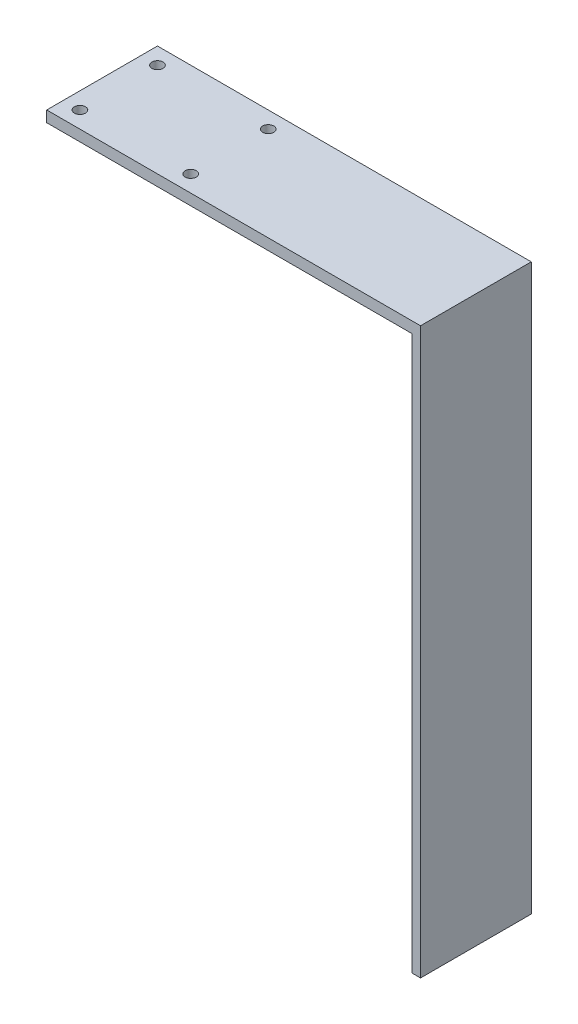
ISO-10303-21;
HEADER;
FILE_DESCRIPTION(('STEP AP214'),'2;1');
FILE_NAME('part.step','',(''),(''),'','','');
FILE_SCHEMA(('AUTOMOTIVE_DESIGN { 1 0 10303 214 1 1 1 1 }'));
ENDSEC;
DATA;
#1=APPLICATION_CONTEXT('core data for automotive mechanical design processes');
#2=APPLICATION_PROTOCOL_DEFINITION('international standard','automotive_design',2000,#1);
#3=PRODUCT_CONTEXT('',#1,'mechanical');
#4=PRODUCT('Part','Part','',(#3));
#5=PRODUCT_RELATED_PRODUCT_CATEGORY('part','',(#4));
#6=PRODUCT_DEFINITION_FORMATION('','',#4);
#7=PRODUCT_DEFINITION_CONTEXT('part definition',#1,'design');
#8=PRODUCT_DEFINITION('design','',#6,#7);
#9=PRODUCT_DEFINITION_SHAPE('','',#8);
#10=(LENGTH_UNIT() NAMED_UNIT(*) SI_UNIT(.MILLI.,.METRE.));
#11=(NAMED_UNIT(*) PLANE_ANGLE_UNIT() SI_UNIT($,.RADIAN.));
#12=(NAMED_UNIT(*) SI_UNIT($,.STERADIAN.) SOLID_ANGLE_UNIT());
#13=UNCERTAINTY_MEASURE_WITH_UNIT(LENGTH_MEASURE(1.E-05),#10,'distance_accuracy_value','');
#14=(GEOMETRIC_REPRESENTATION_CONTEXT(3) GLOBAL_UNCERTAINTY_ASSIGNED_CONTEXT((#13)) GLOBAL_UNIT_ASSIGNED_CONTEXT((#10,
#11,#12)) REPRESENTATION_CONTEXT('',''));
#15=CARTESIAN_POINT('',(0.,0.,0.));
#16=DIRECTION('',(0.,0.,1.));
#17=DIRECTION('',(1.,0.,0.));
#18=AXIS2_PLACEMENT_3D('',#15,#16,#17);
#19=CARTESIAN_POINT('',(0.,0.,0.));
#20=DIRECTION('',(0.,1.,0.));
#21=DIRECTION('',(0.,0.,1.));
#22=AXIS2_PLACEMENT_3D('',#19,#20,#21);
#23=PLANE('',#22);
#24=CARTESIAN_POINT('',(-61.5,0.,-14.));
#25=DIRECTION('',(0.,1.,0.));
#26=DIRECTION('',(0.,0.,1.));
#27=AXIS2_PLACEMENT_3D('',#24,#25,#26);
#28=CIRCLE('',#27,2.);
#29=CARTESIAN_POINT('',(-61.5,0.,-12.));
#30=VERTEX_POINT('',#29);
#31=EDGE_CURVE('E127',#30,#30,#28,.T.);
#32=ORIENTED_EDGE('',*,*,#31,.T.);
#33=EDGE_LOOP('',(#32));
#34=FACE_BOUND('',#33,.T.);
#35=CARTESIAN_POINT('',(-21.5,0.,14.));
#36=DIRECTION('',(0.,1.,0.));
#37=DIRECTION('',(0.,0.,1.));
#38=AXIS2_PLACEMENT_3D('',#35,#36,#37);
#39=CIRCLE('',#38,2.);
#40=CARTESIAN_POINT('',(-21.5,0.,16.));
#41=VERTEX_POINT('',#40);
#42=EDGE_CURVE('E131',#41,#41,#39,.T.);
#43=ORIENTED_EDGE('',*,*,#42,.T.);
#44=EDGE_LOOP('',(#43));
#45=FACE_BOUND('',#44,.T.);
#46=CARTESIAN_POINT('',(-61.5,0.,14.));
#47=DIRECTION('',(0.,1.,0.));
#48=DIRECTION('',(0.,0.,1.));
#49=AXIS2_PLACEMENT_3D('',#46,#47,#48);
#50=CIRCLE('',#49,2.);
#51=CARTESIAN_POINT('',(-61.5,0.,16.));
#52=VERTEX_POINT('',#51);
#53=EDGE_CURVE('E137',#52,#52,#50,.T.);
#54=ORIENTED_EDGE('',*,*,#53,.T.);
#55=EDGE_LOOP('',(#54));
#56=FACE_BOUND('',#55,.T.);
#57=CARTESIAN_POINT('',(-21.5,0.,-14.));
#58=DIRECTION('',(0.,1.,0.));
#59=DIRECTION('',(0.,0.,1.));
#60=AXIS2_PLACEMENT_3D('',#57,#58,#59);
#61=CIRCLE('',#60,2.);
#62=CARTESIAN_POINT('',(-21.5,0.,-12.));
#63=VERTEX_POINT('',#62);
#64=EDGE_CURVE('E143',#63,#63,#61,.T.);
#65=ORIENTED_EDGE('',*,*,#64,.T.);
#66=EDGE_LOOP('',(#65));
#67=FACE_BOUND('',#66,.T.);
#68=DIRECTION('',(0.,0.,-1.));
#69=VECTOR('',#68,1.);
#70=CARTESIAN_POINT('',(64.5,0.,20.));
#71=LINE('',#70,#69);
#72=CARTESIAN_POINT('',(64.5,0.,20.));
#73=VERTEX_POINT('',#72);
#74=CARTESIAN_POINT('',(64.5,0.,-20.));
#75=VERTEX_POINT('',#74);
#76=EDGE_CURVE('E48',#73,#75,#71,.T.);
#77=ORIENTED_EDGE('',*,*,#76,.F.);
#78=DIRECTION('',(1.,0.,0.));
#79=VECTOR('',#78,1.);
#80=CARTESIAN_POINT('',(-67.5,0.,20.));
#81=LINE('',#80,#79);
#82=CARTESIAN_POINT('',(-67.5,0.,20.));
#83=VERTEX_POINT('',#82);
#84=EDGE_CURVE('E153',#83,#73,#81,.T.);
#85=ORIENTED_EDGE('',*,*,#84,.F.);
#86=DIRECTION('',(0.,0.,1.));
#87=VECTOR('',#86,1.);
#88=CARTESIAN_POINT('',(-67.5,0.,-20.));
#89=LINE('',#88,#87);
#90=CARTESIAN_POINT('',(-67.5,0.,-20.));
#91=VERTEX_POINT('',#90);
#92=EDGE_CURVE('E73',#91,#83,#89,.T.);
#93=ORIENTED_EDGE('',*,*,#92,.F.);
#94=DIRECTION('',(-1.,0.,0.));
#95=VECTOR('',#94,1.);
#96=CARTESIAN_POINT('',(-67.5,0.,-20.));
#97=LINE('',#96,#95);
#98=EDGE_CURVE('E149',#75,#91,#97,.T.);
#99=ORIENTED_EDGE('',*,*,#98,.F.);
#100=EDGE_LOOP('',(#77,#85,#93,#99));
#101=FACE_BOUND('',#100,.T.);
#102=ADVANCED_FACE('F33',(#34,#45,#56,#67,#101),#23,.F.);
#103=CARTESIAN_POINT('',(0.,4.,0.));
#104=DIRECTION('',(0.,1.,0.));
#105=DIRECTION('',(0.,0.,1.));
#106=AXIS2_PLACEMENT_3D('',#103,#104,#105);
#107=PLANE('',#106);
#108=CARTESIAN_POINT('',(-21.5,4.,14.));
#109=DIRECTION('',(0.,1.,0.));
#110=DIRECTION('',(0.,0.,1.));
#111=AXIS2_PLACEMENT_3D('',#108,#109,#110);
#112=CIRCLE('',#111,2.);
#113=CARTESIAN_POINT('',(-21.5,4.,16.));
#114=VERTEX_POINT('',#113);
#115=EDGE_CURVE('E134',#114,#114,#112,.T.);
#116=ORIENTED_EDGE('',*,*,#115,.F.);
#117=EDGE_LOOP('',(#116));
#118=FACE_BOUND('',#117,.T.);
#119=CARTESIAN_POINT('',(-21.5,4.,-14.));
#120=DIRECTION('',(0.,1.,0.));
#121=DIRECTION('',(0.,0.,1.));
#122=AXIS2_PLACEMENT_3D('',#119,#120,#121);
#123=CIRCLE('',#122,2.);
#124=CARTESIAN_POINT('',(-21.5,4.,-12.));
#125=VERTEX_POINT('',#124);
#126=EDGE_CURVE('E146',#125,#125,#123,.T.);
#127=ORIENTED_EDGE('',*,*,#126,.F.);
#128=EDGE_LOOP('',(#127));
#129=FACE_BOUND('',#128,.T.);
#130=DIRECTION('',(0.,0.,-1.));
#131=VECTOR('',#130,1.);
#132=CARTESIAN_POINT('',(67.5,4.,-20.));
#133=LINE('',#132,#131);
#134=CARTESIAN_POINT('',(67.5,4.,20.));
#135=VERTEX_POINT('',#134);
#136=CARTESIAN_POINT('',(67.5,4.,-20.));
#137=VERTEX_POINT('',#136);
#138=EDGE_CURVE('E101',#135,#137,#133,.T.);
#139=ORIENTED_EDGE('',*,*,#138,.T.);
#140=DIRECTION('',(-1.,0.,0.));
#141=VECTOR('',#140,1.);
#142=CARTESIAN_POINT('',(-67.5,4.,-20.));
#143=LINE('',#142,#141);
#144=CARTESIAN_POINT('',(-67.5,4.,-20.));
#145=VERTEX_POINT('',#144);
#146=EDGE_CURVE('E80',#137,#145,#143,.T.);
#147=ORIENTED_EDGE('',*,*,#146,.T.);
#148=DIRECTION('',(0.,0.,1.));
#149=VECTOR('',#148,1.);
#150=CARTESIAN_POINT('',(-67.5,4.,-20.));
#151=LINE('',#150,#149);
#152=CARTESIAN_POINT('',(-67.5,4.,20.));
#153=VERTEX_POINT('',#152);
#154=EDGE_CURVE('E155',#145,#153,#151,.T.);
#155=ORIENTED_EDGE('',*,*,#154,.T.);
#156=DIRECTION('',(1.,0.,0.));
#157=VECTOR('',#156,1.);
#158=CARTESIAN_POINT('',(-67.5,4.,20.));
#159=LINE('',#158,#157);
#160=EDGE_CURVE('E57',#153,#135,#159,.T.);
#161=ORIENTED_EDGE('',*,*,#160,.T.);
#162=EDGE_LOOP('',(#139,#147,#155,#161));
#163=FACE_BOUND('',#162,.T.);
#164=CARTESIAN_POINT('',(-61.5,4.,14.));
#165=DIRECTION('',(0.,1.,0.));
#166=DIRECTION('',(0.,0.,1.));
#167=AXIS2_PLACEMENT_3D('',#164,#165,#166);
#168=CIRCLE('',#167,2.);
#169=CARTESIAN_POINT('',(-61.5,4.,16.));
#170=VERTEX_POINT('',#169);
#171=EDGE_CURVE('E140',#170,#170,#168,.T.);
#172=ORIENTED_EDGE('',*,*,#171,.F.);
#173=EDGE_LOOP('',(#172));
#174=FACE_BOUND('',#173,.T.);
#175=CARTESIAN_POINT('',(-61.5,4.,-14.));
#176=DIRECTION('',(0.,1.,0.));
#177=DIRECTION('',(0.,0.,1.));
#178=AXIS2_PLACEMENT_3D('',#175,#176,#177);
#179=CIRCLE('',#178,2.);
#180=CARTESIAN_POINT('',(-61.5,4.,-12.));
#181=VERTEX_POINT('',#180);
#182=EDGE_CURVE('E128',#181,#181,#179,.T.);
#183=ORIENTED_EDGE('',*,*,#182,.F.);
#184=EDGE_LOOP('',(#183));
#185=FACE_BOUND('',#184,.T.);
#186=ADVANCED_FACE('F173',(#118,#129,#163,#174,#185),#107,.T.);
#187=CARTESIAN_POINT('',(67.5,4.,-20.));
#188=DIRECTION('',(-1.,0.,0.));
#189=DIRECTION('',(0.,0.,1.));
#190=AXIS2_PLACEMENT_3D('',#187,#188,#189);
#191=PLANE('',#190);
#192=DIRECTION('',(0.,-1.,0.));
#193=VECTOR('',#192,1.);
#194=CARTESIAN_POINT('',(67.5,4.,20.));
#195=LINE('',#194,#193);
#196=CARTESIAN_POINT('',(67.5,-200.,20.));
#197=VERTEX_POINT('',#196);
#198=EDGE_CURVE('E96',#135,#197,#195,.T.);
#199=ORIENTED_EDGE('',*,*,#198,.T.);
#200=DIRECTION('',(0.,0.,1.));
#201=VECTOR('',#200,1.);
#202=CARTESIAN_POINT('',(67.5,-200.,20.));
#203=LINE('',#202,#201);
#204=CARTESIAN_POINT('',(67.5,-200.,-20.));
#205=VERTEX_POINT('',#204);
#206=EDGE_CURVE('E100',#205,#197,#203,.T.);
#207=ORIENTED_EDGE('',*,*,#206,.F.);
#208=DIRECTION('',(0.,-1.,0.));
#209=VECTOR('',#208,1.);
#210=CARTESIAN_POINT('',(67.5,4.,-20.));
#211=LINE('',#210,#209);
#212=EDGE_CURVE('E11',#137,#205,#211,.T.);
#213=ORIENTED_EDGE('',*,*,#212,.F.);
#214=ORIENTED_EDGE('',*,*,#138,.F.);
#215=EDGE_LOOP('',(#199,#207,#213,#214));
#216=FACE_BOUND('',#215,.T.);
#217=ADVANCED_FACE('F35',(#216),#191,.F.);
#218=CARTESIAN_POINT('',(-67.5,4.,-20.));
#219=DIRECTION('',(0.,0.,1.));
#220=DIRECTION('',(1.,0.,0.));
#221=AXIS2_PLACEMENT_3D('',#218,#219,#220);
#222=PLANE('',#221);
#223=ORIENTED_EDGE('',*,*,#212,.T.);
#224=DIRECTION('',(1.,0.,0.));
#225=VECTOR('',#224,1.);
#226=CARTESIAN_POINT('',(67.5,-200.,-20.));
#227=LINE('',#226,#225);
#228=CARTESIAN_POINT('',(64.5,-200.,-20.));
#229=VERTEX_POINT('',#228);
#230=EDGE_CURVE('E117',#229,#205,#227,.T.);
#231=ORIENTED_EDGE('',*,*,#230,.F.);
#232=DIRECTION('',(0.,1.,0.));
#233=VECTOR('',#232,1.);
#234=CARTESIAN_POINT('',(64.5,-200.,-20.));
#235=LINE('',#234,#233);
#236=EDGE_CURVE('E122',#229,#75,#235,.T.);
#237=ORIENTED_EDGE('',*,*,#236,.T.);
#238=ORIENTED_EDGE('',*,*,#98,.T.);
#239=DIRECTION('',(0.,-1.,0.));
#240=VECTOR('',#239,1.);
#241=CARTESIAN_POINT('',(-67.5,4.,-20.));
#242=LINE('',#241,#240);
#243=EDGE_CURVE('E41',#145,#91,#242,.T.);
#244=ORIENTED_EDGE('',*,*,#243,.F.);
#245=ORIENTED_EDGE('',*,*,#146,.F.);
#246=EDGE_LOOP('',(#223,#231,#237,#238,#244,#245));
#247=FACE_BOUND('',#246,.T.);
#248=ADVANCED_FACE('F166',(#247),#222,.F.);
#249=CARTESIAN_POINT('',(-67.5,4.,-20.));
#250=DIRECTION('',(1.,0.,0.));
#251=DIRECTION('',(0.,0.,-1.));
#252=AXIS2_PLACEMENT_3D('',#249,#250,#251);
#253=PLANE('',#252);
#254=ORIENTED_EDGE('',*,*,#92,.T.);
#255=DIRECTION('',(0.,-1.,0.));
#256=VECTOR('',#255,1.);
#257=CARTESIAN_POINT('',(-67.5,4.,20.));
#258=LINE('',#257,#256);
#259=EDGE_CURVE('E103',#153,#83,#258,.T.);
#260=ORIENTED_EDGE('',*,*,#259,.F.);
#261=ORIENTED_EDGE('',*,*,#154,.F.);
#262=ORIENTED_EDGE('',*,*,#243,.T.);
#263=EDGE_LOOP('',(#254,#260,#261,#262));
#264=FACE_BOUND('',#263,.T.);
#265=ADVANCED_FACE('F162',(#264),#253,.F.);
#266=CARTESIAN_POINT('',(-67.5,4.,20.));
#267=DIRECTION('',(0.,0.,-1.));
#268=DIRECTION('',(-1.,0.,0.));
#269=AXIS2_PLACEMENT_3D('',#266,#267,#268);
#270=PLANE('',#269);
#271=ORIENTED_EDGE('',*,*,#84,.T.);
#272=DIRECTION('',(0.,1.,0.));
#273=VECTOR('',#272,1.);
#274=CARTESIAN_POINT('',(64.5,-200.,20.));
#275=LINE('',#274,#273);
#276=CARTESIAN_POINT('',(64.5,-200.,20.));
#277=VERTEX_POINT('',#276);
#278=EDGE_CURVE('E109',#277,#73,#275,.T.);
#279=ORIENTED_EDGE('',*,*,#278,.F.);
#280=DIRECTION('',(-1.,0.,0.));
#281=VECTOR('',#280,1.);
#282=CARTESIAN_POINT('',(67.5,-200.,20.));
#283=LINE('',#282,#281);
#284=EDGE_CURVE('E106',#197,#277,#283,.T.);
#285=ORIENTED_EDGE('',*,*,#284,.F.);
#286=ORIENTED_EDGE('',*,*,#198,.F.);
#287=ORIENTED_EDGE('',*,*,#160,.F.);
#288=ORIENTED_EDGE('',*,*,#259,.T.);
#289=EDGE_LOOP('',(#271,#279,#285,#286,#287,#288));
#290=FACE_BOUND('',#289,.T.);
#291=ADVANCED_FACE('F107',(#290),#270,.F.);
#292=CARTESIAN_POINT('',(-21.5,4.,-14.));
#293=DIRECTION('',(0.,-1.,0.));
#294=DIRECTION('',(0.,0.,-1.));
#295=AXIS2_PLACEMENT_3D('',#292,#293,#294);
#296=CYLINDRICAL_SURFACE('',#295,2.);
#297=ORIENTED_EDGE('',*,*,#126,.T.);
#298=EDGE_LOOP('',(#297));
#299=FACE_BOUND('',#298,.T.);
#300=ORIENTED_EDGE('',*,*,#64,.F.);
#301=EDGE_LOOP('',(#300));
#302=FACE_BOUND('',#301,.T.);
#303=ADVANCED_FACE('F186',(#299,#302),#296,.F.);
#304=CARTESIAN_POINT('',(-61.5,4.,14.));
#305=DIRECTION('',(0.,-1.,0.));
#306=DIRECTION('',(0.,0.,-1.));
#307=AXIS2_PLACEMENT_3D('',#304,#305,#306);
#308=CYLINDRICAL_SURFACE('',#307,2.);
#309=ORIENTED_EDGE('',*,*,#171,.T.);
#310=EDGE_LOOP('',(#309));
#311=FACE_BOUND('',#310,.T.);
#312=ORIENTED_EDGE('',*,*,#53,.F.);
#313=EDGE_LOOP('',(#312));
#314=FACE_BOUND('',#313,.T.);
#315=ADVANCED_FACE('F190',(#311,#314),#308,.F.);
#316=CARTESIAN_POINT('',(-21.5,4.,14.));
#317=DIRECTION('',(0.,-1.,0.));
#318=DIRECTION('',(0.,0.,-1.));
#319=AXIS2_PLACEMENT_3D('',#316,#317,#318);
#320=CYLINDRICAL_SURFACE('',#319,2.);
#321=ORIENTED_EDGE('',*,*,#115,.T.);
#322=EDGE_LOOP('',(#321));
#323=FACE_BOUND('',#322,.T.);
#324=ORIENTED_EDGE('',*,*,#42,.F.);
#325=EDGE_LOOP('',(#324));
#326=FACE_BOUND('',#325,.T.);
#327=ADVANCED_FACE('F195',(#323,#326),#320,.F.);
#328=CARTESIAN_POINT('',(-61.5,4.,-14.));
#329=DIRECTION('',(0.,-1.,0.));
#330=DIRECTION('',(0.,0.,-1.));
#331=AXIS2_PLACEMENT_3D('',#328,#329,#330);
#332=CYLINDRICAL_SURFACE('',#331,2.);
#333=ORIENTED_EDGE('',*,*,#182,.T.);
#334=EDGE_LOOP('',(#333));
#335=FACE_BOUND('',#334,.T.);
#336=ORIENTED_EDGE('',*,*,#31,.F.);
#337=EDGE_LOOP('',(#336));
#338=FACE_BOUND('',#337,.T.);
#339=ADVANCED_FACE('F202',(#335,#338),#332,.F.);
#340=CARTESIAN_POINT('',(64.5,-200.,20.));
#341=DIRECTION('',(1.,0.,0.));
#342=DIRECTION('',(0.,0.,-1.));
#343=AXIS2_PLACEMENT_3D('',#340,#341,#342);
#344=PLANE('',#343);
#345=ORIENTED_EDGE('',*,*,#76,.T.);
#346=ORIENTED_EDGE('',*,*,#236,.F.);
#347=DIRECTION('',(0.,0.,-1.));
#348=VECTOR('',#347,1.);
#349=CARTESIAN_POINT('',(64.5,-200.,20.));
#350=LINE('',#349,#348);
#351=EDGE_CURVE('E112',#277,#229,#350,.T.);
#352=ORIENTED_EDGE('',*,*,#351,.F.);
#353=ORIENTED_EDGE('',*,*,#278,.T.);
#354=EDGE_LOOP('',(#345,#346,#352,#353));
#355=FACE_BOUND('',#354,.T.);
#356=ADVANCED_FACE('F164',(#355),#344,.F.);
#357=CARTESIAN_POINT('',(0.,-200.,0.));
#358=DIRECTION('',(0.,1.,0.));
#359=DIRECTION('',(0.,0.,1.));
#360=AXIS2_PLACEMENT_3D('',#357,#358,#359);
#361=PLANE('',#360);
#362=ORIENTED_EDGE('',*,*,#206,.T.);
#363=ORIENTED_EDGE('',*,*,#284,.T.);
#364=ORIENTED_EDGE('',*,*,#351,.T.);
#365=ORIENTED_EDGE('',*,*,#230,.T.);
#366=EDGE_LOOP('',(#362,#363,#364,#365));
#367=FACE_BOUND('',#366,.T.);
#368=ADVANCED_FACE('F115',(#367),#361,.F.);
#369=CLOSED_SHELL('',(#102,#186,#217,#248,#265,#291,#303,#315,#327,#339,#356,#368));
#370=MANIFOLD_SOLID_BREP('B2',#369);
#371=ADVANCED_BREP_SHAPE_REPRESENTATION('',(#18,#370),#14);
#372=SHAPE_DEFINITION_REPRESENTATION(#9,#371);
ENDSEC;
END-ISO-10303-21;
